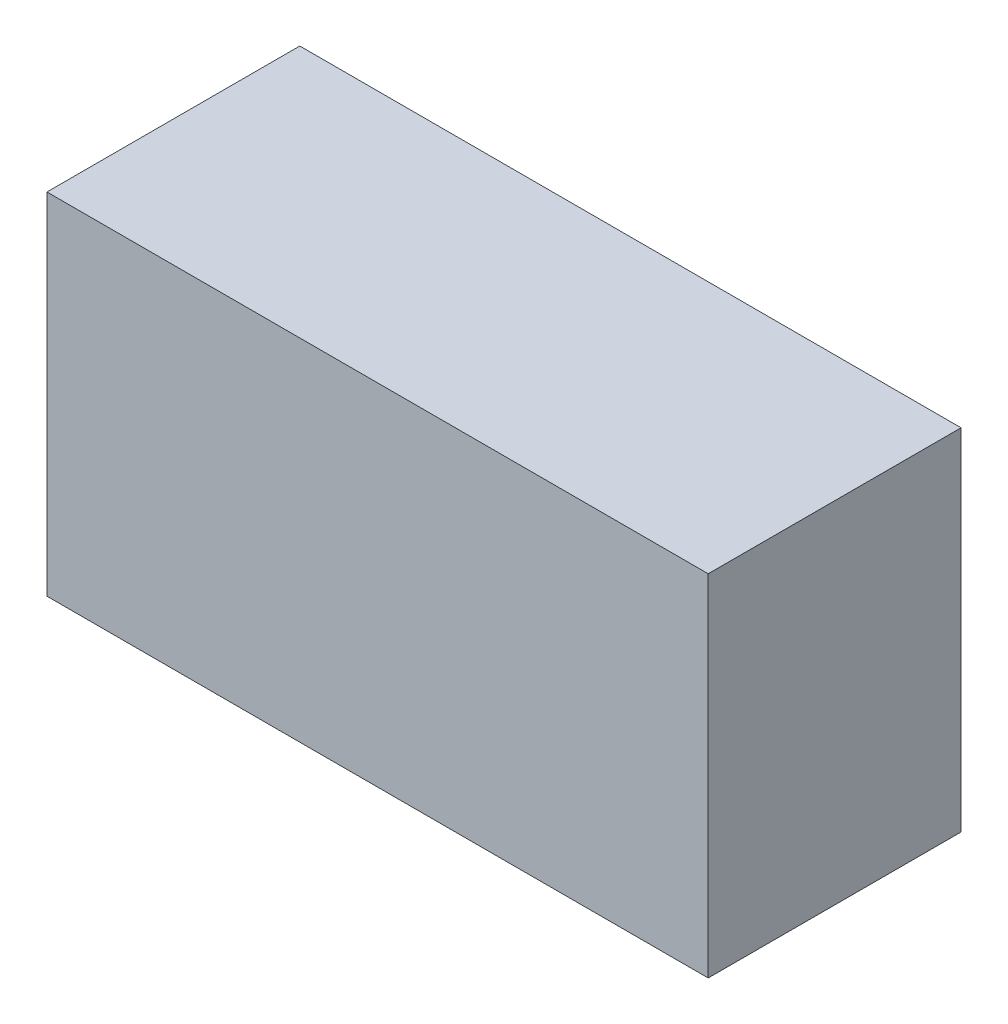
ISO-10303-21;
HEADER;
FILE_DESCRIPTION(('STEP AP214'),'2;1');
FILE_NAME('part.step','',(''),(''),'','','');
FILE_SCHEMA(('AUTOMOTIVE_DESIGN { 1 0 10303 214 1 1 1 1 }'));
ENDSEC;
DATA;
#1=APPLICATION_CONTEXT('core data for automotive mechanical design processes');
#2=APPLICATION_PROTOCOL_DEFINITION('international standard','automotive_design',2000,#1);
#3=PRODUCT_CONTEXT('',#1,'mechanical');
#4=PRODUCT('Part','Part','',(#3));
#5=PRODUCT_RELATED_PRODUCT_CATEGORY('part','',(#4));
#6=PRODUCT_DEFINITION_FORMATION('','',#4);
#7=PRODUCT_DEFINITION_CONTEXT('part definition',#1,'design');
#8=PRODUCT_DEFINITION('design','',#6,#7);
#9=PRODUCT_DEFINITION_SHAPE('','',#8);
#10=(LENGTH_UNIT() NAMED_UNIT(*) SI_UNIT(.MILLI.,.METRE.));
#11=(NAMED_UNIT(*) PLANE_ANGLE_UNIT() SI_UNIT($,.RADIAN.));
#12=(NAMED_UNIT(*) SI_UNIT($,.STERADIAN.) SOLID_ANGLE_UNIT());
#13=UNCERTAINTY_MEASURE_WITH_UNIT(LENGTH_MEASURE(1.E-05),#10,'distance_accuracy_value','');
#14=(GEOMETRIC_REPRESENTATION_CONTEXT(3) GLOBAL_UNCERTAINTY_ASSIGNED_CONTEXT((#13)) GLOBAL_UNIT_ASSIGNED_CONTEXT((#10,
#11,#12)) REPRESENTATION_CONTEXT('',''));
#15=CARTESIAN_POINT('',(0.,0.,0.));
#16=DIRECTION('',(0.,0.,1.));
#17=DIRECTION('',(1.,0.,0.));
#18=AXIS2_PLACEMENT_3D('',#15,#16,#17);
#19=CARTESIAN_POINT('',(25.5,-13.5,19.5));
#20=DIRECTION('',(-1.,0.,0.));
#21=DIRECTION('',(0.,0.,1.));
#22=AXIS2_PLACEMENT_3D('',#19,#20,#21);
#23=PLANE('',#22);
#24=DIRECTION('',(0.,1.,0.));
#25=VECTOR('',#24,1.);
#26=CARTESIAN_POINT('',(25.5,-13.5,0.));
#27=LINE('',#26,#25);
#28=CARTESIAN_POINT('',(25.5,-13.5,0.));
#29=VERTEX_POINT('',#28);
#30=CARTESIAN_POINT('',(25.5,13.5,0.));
#31=VERTEX_POINT('',#30);
#32=EDGE_CURVE('E113',#29,#31,#27,.T.);
#33=ORIENTED_EDGE('',*,*,#32,.T.);
#34=DIRECTION('',(0.,0.,-1.));
#35=VECTOR('',#34,1.);
#36=CARTESIAN_POINT('',(25.5,13.5,19.5));
#37=LINE('',#36,#35);
#38=CARTESIAN_POINT('',(25.5,13.5,19.5));
#39=VERTEX_POINT('',#38);
#40=EDGE_CURVE('E11',#39,#31,#37,.T.);
#41=ORIENTED_EDGE('',*,*,#40,.F.);
#42=DIRECTION('',(0.,1.,0.));
#43=VECTOR('',#42,1.);
#44=CARTESIAN_POINT('',(25.5,-13.5,19.5));
#45=LINE('',#44,#43);
#46=CARTESIAN_POINT('',(25.5,-13.5,19.5));
#47=VERTEX_POINT('',#46);
#48=EDGE_CURVE('E95',#47,#39,#45,.T.);
#49=ORIENTED_EDGE('',*,*,#48,.F.);
#50=DIRECTION('',(0.,0.,-1.));
#51=VECTOR('',#50,1.);
#52=CARTESIAN_POINT('',(25.5,-13.5,19.5));
#53=LINE('',#52,#51);
#54=EDGE_CURVE('E109',#47,#29,#53,.T.);
#55=ORIENTED_EDGE('',*,*,#54,.T.);
#56=EDGE_LOOP('',(#33,#41,#49,#55));
#57=FACE_BOUND('',#56,.T.);
#58=ADVANCED_FACE('F43',(#57),#23,.F.);
#59=CARTESIAN_POINT('',(-25.5,13.5,19.5));
#60=DIRECTION('',(0.,-1.,0.));
#61=DIRECTION('',(0.,0.,-1.));
#62=AXIS2_PLACEMENT_3D('',#59,#60,#61);
#63=PLANE('',#62);
#64=DIRECTION('',(-1.,0.,0.));
#65=VECTOR('',#64,1.);
#66=CARTESIAN_POINT('',(-25.5,13.5,0.));
#67=LINE('',#66,#65);
#68=CARTESIAN_POINT('',(-25.5,13.5,0.));
#69=VERTEX_POINT('',#68);
#70=EDGE_CURVE('E100',#31,#69,#67,.T.);
#71=ORIENTED_EDGE('',*,*,#70,.T.);
#72=DIRECTION('',(0.,0.,-1.));
#73=VECTOR('',#72,1.);
#74=CARTESIAN_POINT('',(-25.5,13.5,19.5));
#75=LINE('',#74,#73);
#76=CARTESIAN_POINT('',(-25.5,13.5,19.5));
#77=VERTEX_POINT('',#76);
#78=EDGE_CURVE('E52',#77,#69,#75,.T.);
#79=ORIENTED_EDGE('',*,*,#78,.F.);
#80=DIRECTION('',(-1.,0.,0.));
#81=VECTOR('',#80,1.);
#82=CARTESIAN_POINT('',(-25.5,13.5,19.5));
#83=LINE('',#82,#81);
#84=EDGE_CURVE('E90',#39,#77,#83,.T.);
#85=ORIENTED_EDGE('',*,*,#84,.F.);
#86=ORIENTED_EDGE('',*,*,#40,.T.);
#87=EDGE_LOOP('',(#71,#79,#85,#86));
#88=FACE_BOUND('',#87,.T.);
#89=ADVANCED_FACE('F99',(#88),#63,.F.);
#90=CARTESIAN_POINT('',(-25.5,-13.5,19.5));
#91=DIRECTION('',(1.,0.,0.));
#92=DIRECTION('',(0.,0.,-1.));
#93=AXIS2_PLACEMENT_3D('',#90,#91,#92);
#94=PLANE('',#93);
#95=DIRECTION('',(0.,-1.,0.));
#96=VECTOR('',#95,1.);
#97=CARTESIAN_POINT('',(-25.5,-13.5,0.));
#98=LINE('',#97,#96);
#99=CARTESIAN_POINT('',(-25.5,-13.5,0.));
#100=VERTEX_POINT('',#99);
#101=EDGE_CURVE('E77',#69,#100,#98,.T.);
#102=ORIENTED_EDGE('',*,*,#101,.T.);
#103=DIRECTION('',(0.,0.,-1.));
#104=VECTOR('',#103,1.);
#105=CARTESIAN_POINT('',(-25.5,-13.5,19.5));
#106=LINE('',#105,#104);
#107=CARTESIAN_POINT('',(-25.5,-13.5,19.5));
#108=VERTEX_POINT('',#107);
#109=EDGE_CURVE('E102',#108,#100,#106,.T.);
#110=ORIENTED_EDGE('',*,*,#109,.F.);
#111=DIRECTION('',(0.,-1.,0.));
#112=VECTOR('',#111,1.);
#113=CARTESIAN_POINT('',(-25.5,-13.5,19.5));
#114=LINE('',#113,#112);
#115=EDGE_CURVE('E93',#77,#108,#114,.T.);
#116=ORIENTED_EDGE('',*,*,#115,.F.);
#117=ORIENTED_EDGE('',*,*,#78,.T.);
#118=EDGE_LOOP('',(#102,#110,#116,#117));
#119=FACE_BOUND('',#118,.T.);
#120=ADVANCED_FACE('F103',(#119),#94,.F.);
#121=CARTESIAN_POINT('',(-25.5,-13.5,19.5));
#122=DIRECTION('',(0.,1.,0.));
#123=DIRECTION('',(0.,0.,1.));
#124=AXIS2_PLACEMENT_3D('',#121,#122,#123);
#125=PLANE('',#124);
#126=DIRECTION('',(1.,0.,0.));
#127=VECTOR('',#126,1.);
#128=CARTESIAN_POINT('',(-25.5,-13.5,0.));
#129=LINE('',#128,#127);
#130=EDGE_CURVE('E83',#100,#29,#129,.T.);
#131=ORIENTED_EDGE('',*,*,#130,.T.);
#132=ORIENTED_EDGE('',*,*,#54,.F.);
#133=DIRECTION('',(1.,0.,0.));
#134=VECTOR('',#133,1.);
#135=CARTESIAN_POINT('',(-25.5,-13.5,19.5));
#136=LINE('',#135,#134);
#137=EDGE_CURVE('E60',#108,#47,#136,.T.);
#138=ORIENTED_EDGE('',*,*,#137,.F.);
#139=ORIENTED_EDGE('',*,*,#109,.T.);
#140=EDGE_LOOP('',(#131,#132,#138,#139));
#141=FACE_BOUND('',#140,.T.);
#142=ADVANCED_FACE('F124',(#141),#125,.F.);
#143=CARTESIAN_POINT('',(0.,0.,19.5));
#144=DIRECTION('',(0.,0.,-1.));
#145=DIRECTION('',(-1.,0.,0.));
#146=AXIS2_PLACEMENT_3D('',#143,#144,#145);
#147=PLANE('',#146);
#148=ORIENTED_EDGE('',*,*,#48,.T.);
#149=ORIENTED_EDGE('',*,*,#84,.T.);
#150=ORIENTED_EDGE('',*,*,#115,.T.);
#151=ORIENTED_EDGE('',*,*,#137,.T.);
#152=EDGE_LOOP('',(#148,#149,#150,#151));
#153=FACE_BOUND('',#152,.T.);
#154=ADVANCED_FACE('F91',(#153),#147,.F.);
#155=CARTESIAN_POINT('',(0.,0.,0.));
#156=DIRECTION('',(0.,0.,-1.));
#157=DIRECTION('',(-1.,0.,0.));
#158=AXIS2_PLACEMENT_3D('',#155,#156,#157);
#159=PLANE('',#158);
#160=ORIENTED_EDGE('',*,*,#32,.F.);
#161=ORIENTED_EDGE('',*,*,#130,.F.);
#162=ORIENTED_EDGE('',*,*,#101,.F.);
#163=ORIENTED_EDGE('',*,*,#70,.F.);
#164=EDGE_LOOP('',(#160,#161,#162,#163));
#165=FACE_BOUND('',#164,.T.);
#166=ADVANCED_FACE('F127',(#165),#159,.T.);
#167=CLOSED_SHELL('',(#58,#89,#120,#142,#154,#166));
#168=MANIFOLD_SOLID_BREP('B2',#167);
#169=ADVANCED_BREP_SHAPE_REPRESENTATION('',(#18,#168),#14);
#170=SHAPE_DEFINITION_REPRESENTATION(#9,#169);
ENDSEC;
END-ISO-10303-21;
